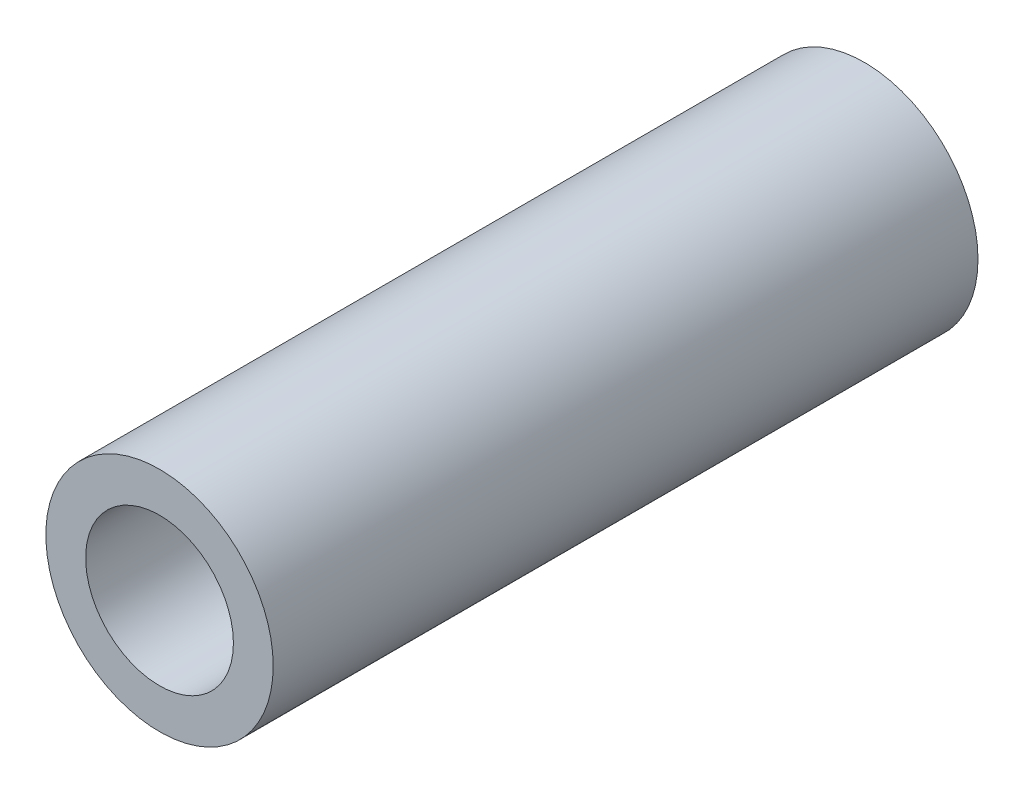
ISO-10303-21;
HEADER;
FILE_DESCRIPTION(('STEP AP214'),'2;1');
FILE_NAME('part.step','',(''),(''),'','','');
FILE_SCHEMA(('AUTOMOTIVE_DESIGN { 1 0 10303 214 1 1 1 1 }'));
ENDSEC;
DATA;
#1=APPLICATION_CONTEXT('core data for automotive mechanical design processes');
#2=APPLICATION_PROTOCOL_DEFINITION('international standard','automotive_design',2000,#1);
#3=PRODUCT_CONTEXT('',#1,'mechanical');
#4=PRODUCT('Part','Part','',(#3));
#5=PRODUCT_RELATED_PRODUCT_CATEGORY('part','',(#4));
#6=PRODUCT_DEFINITION_FORMATION('','',#4);
#7=PRODUCT_DEFINITION_CONTEXT('part definition',#1,'design');
#8=PRODUCT_DEFINITION('design','',#6,#7);
#9=PRODUCT_DEFINITION_SHAPE('','',#8);
#10=(LENGTH_UNIT() NAMED_UNIT(*) SI_UNIT(.MILLI.,.METRE.));
#11=(NAMED_UNIT(*) PLANE_ANGLE_UNIT() SI_UNIT($,.RADIAN.));
#12=(NAMED_UNIT(*) SI_UNIT($,.STERADIAN.) SOLID_ANGLE_UNIT());
#13=UNCERTAINTY_MEASURE_WITH_UNIT(LENGTH_MEASURE(1.E-05),#10,'distance_accuracy_value','');
#14=(GEOMETRIC_REPRESENTATION_CONTEXT(3) GLOBAL_UNCERTAINTY_ASSIGNED_CONTEXT((#13)) GLOBAL_UNIT_ASSIGNED_CONTEXT((#10,
#11,#12)) REPRESENTATION_CONTEXT('',''));
#15=CARTESIAN_POINT('',(0.,0.,0.));
#16=DIRECTION('',(0.,0.,1.));
#17=DIRECTION('',(1.,0.,0.));
#18=AXIS2_PLACEMENT_3D('',#15,#16,#17);
#19=CARTESIAN_POINT('',(0.,0.,62.));
#20=DIRECTION('',(0.,0.,1.));
#21=DIRECTION('',(1.,0.,0.));
#22=AXIS2_PLACEMENT_3D('',#19,#20,#21);
#23=PLANE('',#22);
#24=CARTESIAN_POINT('',(0.,0.,62.));
#25=DIRECTION('',(0.,0.,1.));
#26=DIRECTION('',(1.,0.,0.));
#27=AXIS2_PLACEMENT_3D('',#24,#25,#26);
#28=CIRCLE('',#27,10.);
#29=CARTESIAN_POINT('',(10.,0.,62.));
#30=VERTEX_POINT('',#29);
#31=EDGE_CURVE('E10',#30,#30,#28,.T.);
#32=ORIENTED_EDGE('',*,*,#31,.T.);
#33=EDGE_LOOP('',(#32));
#34=FACE_BOUND('',#33,.T.);
#35=CARTESIAN_POINT('',(0.,0.,62.));
#36=DIRECTION('',(0.,0.,1.));
#37=DIRECTION('',(1.,0.,0.));
#38=AXIS2_PLACEMENT_3D('',#35,#36,#37);
#39=CIRCLE('',#38,6.5);
#40=CARTESIAN_POINT('',(6.5,0.,62.));
#41=VERTEX_POINT('',#40);
#42=EDGE_CURVE('E42',#41,#41,#39,.T.);
#43=ORIENTED_EDGE('',*,*,#42,.F.);
#44=EDGE_LOOP('',(#43));
#45=FACE_BOUND('',#44,.T.);
#46=ADVANCED_FACE('F31',(#34,#45),#23,.T.);
#47=CARTESIAN_POINT('',(0.,0.,0.));
#48=DIRECTION('',(0.,0.,1.));
#49=DIRECTION('',(1.,0.,0.));
#50=AXIS2_PLACEMENT_3D('',#47,#48,#49);
#51=PLANE('',#50);
#52=CARTESIAN_POINT('',(0.,0.,0.));
#53=DIRECTION('',(0.,0.,1.));
#54=DIRECTION('',(1.,0.,0.));
#55=AXIS2_PLACEMENT_3D('',#52,#53,#54);
#56=CIRCLE('',#55,10.);
#57=CARTESIAN_POINT('',(10.,0.,0.));
#58=VERTEX_POINT('',#57);
#59=EDGE_CURVE('E35',#58,#58,#56,.T.);
#60=ORIENTED_EDGE('',*,*,#59,.F.);
#61=EDGE_LOOP('',(#60));
#62=FACE_BOUND('',#61,.T.);
#63=CARTESIAN_POINT('',(0.,0.,0.));
#64=DIRECTION('',(0.,0.,1.));
#65=DIRECTION('',(1.,0.,0.));
#66=AXIS2_PLACEMENT_3D('',#63,#64,#65);
#67=CIRCLE('',#66,6.5);
#68=CARTESIAN_POINT('',(6.5,0.,0.));
#69=VERTEX_POINT('',#68);
#70=EDGE_CURVE('E44',#69,#69,#67,.T.);
#71=ORIENTED_EDGE('',*,*,#70,.T.);
#72=EDGE_LOOP('',(#71));
#73=FACE_BOUND('',#72,.T.);
#74=ADVANCED_FACE('F54',(#62,#73),#51,.F.);
#75=CARTESIAN_POINT('',(0.,0.,62.));
#76=DIRECTION('',(0.,0.,-1.));
#77=DIRECTION('',(-1.,0.,0.));
#78=AXIS2_PLACEMENT_3D('',#75,#76,#77);
#79=CYLINDRICAL_SURFACE('',#78,10.);
#80=ORIENTED_EDGE('',*,*,#31,.F.);
#81=EDGE_LOOP('',(#80));
#82=FACE_BOUND('',#81,.T.);
#83=ORIENTED_EDGE('',*,*,#59,.T.);
#84=EDGE_LOOP('',(#83));
#85=FACE_BOUND('',#84,.T.);
#86=ADVANCED_FACE('F33',(#82,#85),#79,.T.);
#87=CARTESIAN_POINT('',(0.,0.,62.));
#88=DIRECTION('',(0.,0.,-1.));
#89=DIRECTION('',(-1.,0.,0.));
#90=AXIS2_PLACEMENT_3D('',#87,#88,#89);
#91=CYLINDRICAL_SURFACE('',#90,6.5);
#92=ORIENTED_EDGE('',*,*,#42,.T.);
#93=EDGE_LOOP('',(#92));
#94=FACE_BOUND('',#93,.T.);
#95=ORIENTED_EDGE('',*,*,#70,.F.);
#96=EDGE_LOOP('',(#95));
#97=FACE_BOUND('',#96,.T.);
#98=ADVANCED_FACE('F50',(#94,#97),#91,.F.);
#99=CLOSED_SHELL('',(#46,#74,#86,#98));
#100=MANIFOLD_SOLID_BREP('B2',#99);
#101=ADVANCED_BREP_SHAPE_REPRESENTATION('',(#18,#100),#14);
#102=SHAPE_DEFINITION_REPRESENTATION(#9,#101);
ENDSEC;
END-ISO-10303-21;
